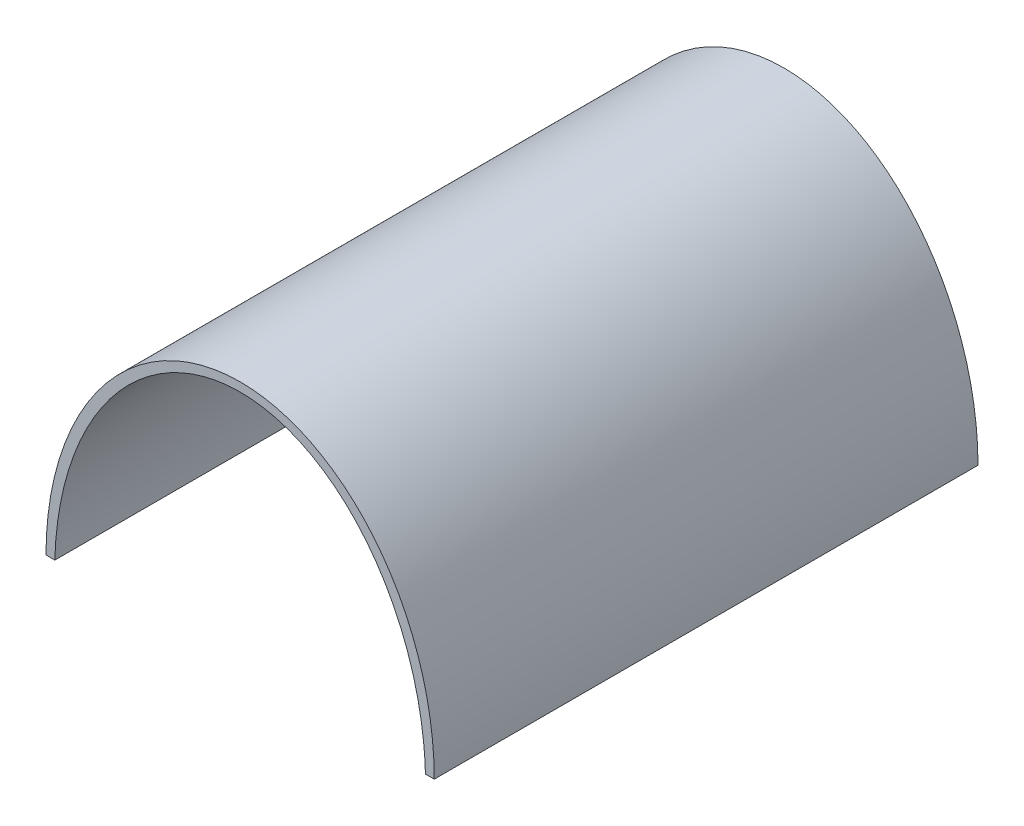
ISO-10303-21;
HEADER;
FILE_DESCRIPTION(('STEP AP214'),'2;1');
FILE_NAME('part.step','',(''),(''),'','','');
FILE_SCHEMA(('AUTOMOTIVE_DESIGN { 1 0 10303 214 1 1 1 1 }'));
ENDSEC;
DATA;
#1=APPLICATION_CONTEXT('core data for automotive mechanical design processes');
#2=APPLICATION_PROTOCOL_DEFINITION('international standard','automotive_design',2000,#1);
#3=PRODUCT_CONTEXT('',#1,'mechanical');
#4=PRODUCT('Part','Part','',(#3));
#5=PRODUCT_RELATED_PRODUCT_CATEGORY('part','',(#4));
#6=PRODUCT_DEFINITION_FORMATION('','',#4);
#7=PRODUCT_DEFINITION_CONTEXT('part definition',#1,'design');
#8=PRODUCT_DEFINITION('design','',#6,#7);
#9=PRODUCT_DEFINITION_SHAPE('','',#8);
#10=(LENGTH_UNIT() NAMED_UNIT(*) SI_UNIT(.MILLI.,.METRE.));
#11=(NAMED_UNIT(*) PLANE_ANGLE_UNIT() SI_UNIT($,.RADIAN.));
#12=(NAMED_UNIT(*) SI_UNIT($,.STERADIAN.) SOLID_ANGLE_UNIT());
#13=UNCERTAINTY_MEASURE_WITH_UNIT(LENGTH_MEASURE(1.E-05),#10,'distance_accuracy_value','');
#14=(GEOMETRIC_REPRESENTATION_CONTEXT(3) GLOBAL_UNCERTAINTY_ASSIGNED_CONTEXT((#13)) GLOBAL_UNIT_ASSIGNED_CONTEXT((#10,
#11,#12)) REPRESENTATION_CONTEXT('',''));
#15=CARTESIAN_POINT('',(0.,0.,0.));
#16=DIRECTION('',(0.,0.,1.));
#17=DIRECTION('',(1.,0.,0.));
#18=AXIS2_PLACEMENT_3D('',#15,#16,#17);
#19=CARTESIAN_POINT('',(0.,0.,-1176.78239422124));
#20=DIRECTION('',(0.,0.,1.));
#21=DIRECTION('',(0.,-1.,0.));
#22=AXIS2_PLACEMENT_3D('',#19,#20,#21);
#23=ELLIPSE('',#22,533.4,419.1);
#24=DIRECTION('',(0.,0.,1.));
#25=VECTOR('',#24,1.);
#26=SURFACE_OF_LINEAR_EXTRUSION('',#23,#25);
#27=CARTESIAN_POINT('',(0.,0.,-183.255947668353));
#28=DIRECTION('',(0.,0.,1.));
#29=DIRECTION('',(0.,-1.,0.));
#30=AXIS2_PLACEMENT_3D('',#27,#28,#29);
#31=ELLIPSE('',#30,533.4,419.1);
#32=CARTESIAN_POINT('',(-419.1,0.,-183.255947668353));
#33=VERTEX_POINT('',#32);
#34=CARTESIAN_POINT('',(419.1,0.,-183.255947668353));
#35=VERTEX_POINT('',#34);
#36=EDGE_CURVE('E43',#33,#35,#31,.F.);
#37=ORIENTED_EDGE('',*,*,#36,.F.);
#38=DIRECTION('',(0.,0.,1.));
#39=VECTOR('',#38,1.);
#40=CARTESIAN_POINT('',(-419.1,0.,-1176.78239422124));
#41=LINE('',#40,#39);
#42=CARTESIAN_POINT('',(-419.1,0.,990.6));
#43=VERTEX_POINT('',#42);
#44=EDGE_CURVE('E71',#33,#43,#41,.T.);
#45=ORIENTED_EDGE('',*,*,#44,.T.);
#46=CARTESIAN_POINT('',(0.,0.,990.6));
#47=DIRECTION('',(0.,0.,1.));
#48=DIRECTION('',(0.,-1.,0.));
#49=AXIS2_PLACEMENT_3D('',#46,#47,#48);
#50=ELLIPSE('',#49,533.4,419.1);
#51=CARTESIAN_POINT('',(419.1,0.,990.6));
#52=VERTEX_POINT('',#51);
#53=EDGE_CURVE('E75',#52,#43,#50,.T.);
#54=ORIENTED_EDGE('',*,*,#53,.F.);
#55=DIRECTION('',(0.,0.,1.));
#56=VECTOR('',#55,1.);
#57=CARTESIAN_POINT('',(419.1,0.,-1176.78239422124));
#58=LINE('',#57,#56);
#59=EDGE_CURVE('E98',#35,#52,#58,.T.);
#60=ORIENTED_EDGE('',*,*,#59,.F.);
#61=EDGE_LOOP('',(#37,#45,#54,#60));
#62=FACE_BOUND('',#61,.T.);
#63=ADVANCED_FACE('F34',(#62),#26,.T.);
#64=CARTESIAN_POINT('',(419.1,0.,-1176.78239422124));
#65=DIRECTION('',(0.,-1.,0.));
#66=DIRECTION('',(1.,0.,0.));
#67=AXIS2_PLACEMENT_3D('',#64,#65,#66);
#68=PLANE('',#67);
#69=DIRECTION('',(-1.,0.,0.));
#70=VECTOR('',#69,1.);
#71=CARTESIAN_POINT('',(419.1,0.,-183.255947668353));
#72=LINE('',#71,#70);
#73=CARTESIAN_POINT('',(400.05,0.,-183.255947668353));
#74=VERTEX_POINT('',#73);
#75=EDGE_CURVE('E49',#35,#74,#72,.T.);
#76=ORIENTED_EDGE('',*,*,#75,.F.);
#77=ORIENTED_EDGE('',*,*,#59,.T.);
#78=DIRECTION('',(1.,0.,0.));
#79=VECTOR('',#78,1.);
#80=CARTESIAN_POINT('',(419.1,0.,990.6));
#81=LINE('',#80,#79);
#82=CARTESIAN_POINT('',(400.05,0.,990.6));
#83=VERTEX_POINT('',#82);
#84=EDGE_CURVE('E79',#83,#52,#81,.T.);
#85=ORIENTED_EDGE('',*,*,#84,.F.);
#86=DIRECTION('',(0.,0.,1.));
#87=VECTOR('',#86,1.);
#88=CARTESIAN_POINT('',(400.05,0.,-1176.78239422124));
#89=LINE('',#88,#87);
#90=EDGE_CURVE('E125',#74,#83,#89,.T.);
#91=ORIENTED_EDGE('',*,*,#90,.F.);
#92=EDGE_LOOP('',(#76,#77,#85,#91));
#93=FACE_BOUND('',#92,.T.);
#94=ADVANCED_FACE('F109',(#93),#68,.T.);
#95=CARTESIAN_POINT('',(0.,-19.05,-1176.78239422124));
#96=DIRECTION('',(0.,0.,-1.));
#97=DIRECTION('',(0.,-1.,0.));
#98=AXIS2_PLACEMENT_3D('',#95,#96,#97);
#99=ELLIPSE('',#98,533.4,400.305378257736);
#100=DIRECTION('',(0.,0.,1.));
#101=VECTOR('',#100,1.);
#102=SURFACE_OF_LINEAR_EXTRUSION('',#99,#101);
#103=CARTESIAN_POINT('',(0.,-19.05,-183.255947668353));
#104=DIRECTION('',(0.,0.,-1.));
#105=DIRECTION('',(0.,-1.,0.));
#106=AXIS2_PLACEMENT_3D('',#103,#104,#105);
#107=ELLIPSE('',#106,533.4,400.305378257736);
#108=CARTESIAN_POINT('',(-400.05,0.,-183.255947668353));
#109=VERTEX_POINT('',#108);
#110=EDGE_CURVE('E96',#74,#109,#107,.F.);
#111=ORIENTED_EDGE('',*,*,#110,.F.);
#112=ORIENTED_EDGE('',*,*,#90,.T.);
#113=CARTESIAN_POINT('',(0.,-19.05,990.6));
#114=DIRECTION('',(0.,0.,-1.));
#115=DIRECTION('',(0.,-1.,0.));
#116=AXIS2_PLACEMENT_3D('',#113,#114,#115);
#117=ELLIPSE('',#116,533.4,400.305378257736);
#118=CARTESIAN_POINT('',(-400.05,0.,990.6));
#119=VERTEX_POINT('',#118);
#120=EDGE_CURVE('E87',#119,#83,#117,.T.);
#121=ORIENTED_EDGE('',*,*,#120,.F.);
#122=DIRECTION('',(0.,0.,1.));
#123=VECTOR('',#122,1.);
#124=CARTESIAN_POINT('',(-400.05,0.,-1176.78239422124));
#125=LINE('',#124,#123);
#126=EDGE_CURVE('E78',#109,#119,#125,.T.);
#127=ORIENTED_EDGE('',*,*,#126,.F.);
#128=EDGE_LOOP('',(#111,#112,#121,#127));
#129=FACE_BOUND('',#128,.T.);
#130=ADVANCED_FACE('F106',(#129),#102,.T.);
#131=CARTESIAN_POINT('',(-419.1,0.,-1176.78239422124));
#132=DIRECTION('',(0.,-1.,0.));
#133=DIRECTION('',(0.,0.,-1.));
#134=AXIS2_PLACEMENT_3D('',#131,#132,#133);
#135=PLANE('',#134);
#136=DIRECTION('',(-1.,0.,0.));
#137=VECTOR('',#136,1.);
#138=CARTESIAN_POINT('',(-419.1,0.,-183.255947668353));
#139=LINE('',#138,#137);
#140=EDGE_CURVE('E11',#109,#33,#139,.T.);
#141=ORIENTED_EDGE('',*,*,#140,.F.);
#142=ORIENTED_EDGE('',*,*,#126,.T.);
#143=DIRECTION('',(1.,0.,0.));
#144=VECTOR('',#143,1.);
#145=CARTESIAN_POINT('',(-419.1,0.,990.6));
#146=LINE('',#145,#144);
#147=EDGE_CURVE('E81',#43,#119,#146,.T.);
#148=ORIENTED_EDGE('',*,*,#147,.F.);
#149=ORIENTED_EDGE('',*,*,#44,.F.);
#150=EDGE_LOOP('',(#141,#142,#148,#149));
#151=FACE_BOUND('',#150,.T.);
#152=ADVANCED_FACE('F82',(#151),#135,.T.);
#153=CARTESIAN_POINT('',(-216.522783942081,-355.978462784022,-183.255947668353));
#154=DIRECTION('',(0.,0.,1.));
#155=DIRECTION('',(0.499999999999989,-0.866025403784445,0.));
#156=AXIS2_PLACEMENT_3D('',#153,#154,#155);
#157=PLANE('',#156);
#158=ORIENTED_EDGE('',*,*,#36,.T.);
#159=ORIENTED_EDGE('',*,*,#75,.T.);
#160=ORIENTED_EDGE('',*,*,#110,.T.);
#161=ORIENTED_EDGE('',*,*,#140,.T.);
#162=EDGE_LOOP('',(#158,#159,#160,#161));
#163=FACE_BOUND('',#162,.T.);
#164=ADVANCED_FACE('F113',(#163),#157,.F.);
#165=CARTESIAN_POINT('',(0.,0.,990.6));
#166=DIRECTION('',(0.,0.,1.));
#167=DIRECTION('',(1.,0.,0.));
#168=AXIS2_PLACEMENT_3D('',#165,#166,#167);
#169=PLANE('',#168);
#170=ORIENTED_EDGE('',*,*,#53,.T.);
#171=ORIENTED_EDGE('',*,*,#147,.T.);
#172=ORIENTED_EDGE('',*,*,#120,.T.);
#173=ORIENTED_EDGE('',*,*,#84,.T.);
#174=EDGE_LOOP('',(#170,#171,#172,#173));
#175=FACE_BOUND('',#174,.T.);
#176=ADVANCED_FACE('F90',(#175),#169,.T.);
#177=CLOSED_SHELL('',(#63,#94,#130,#152,#164,#176));
#178=MANIFOLD_SOLID_BREP('B2',#177);
#179=ADVANCED_BREP_SHAPE_REPRESENTATION('',(#18,#178),#14);
#180=SHAPE_DEFINITION_REPRESENTATION(#9,#179);
ENDSEC;
END-ISO-10303-21;
